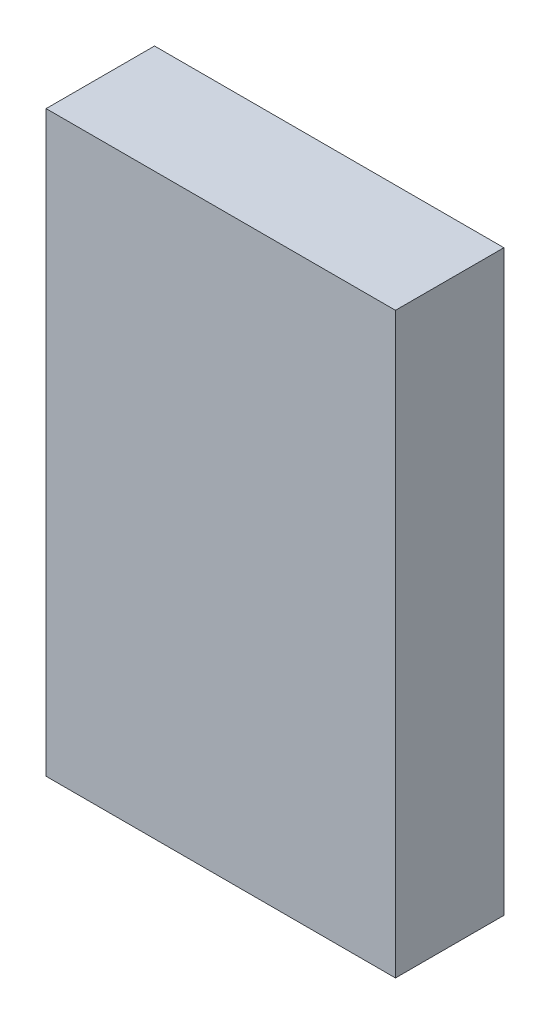
ISO-10303-21;
HEADER;
FILE_DESCRIPTION(('STEP AP214'),'2;1');
FILE_NAME('part.step','',(''),(''),'','','');
FILE_SCHEMA(('AUTOMOTIVE_DESIGN { 1 0 10303 214 1 1 1 1 }'));
ENDSEC;
DATA;
#1=APPLICATION_CONTEXT('core data for automotive mechanical design processes');
#2=APPLICATION_PROTOCOL_DEFINITION('international standard','automotive_design',2000,#1);
#3=PRODUCT_CONTEXT('',#1,'mechanical');
#4=PRODUCT('Part','Part','',(#3));
#5=PRODUCT_RELATED_PRODUCT_CATEGORY('part','',(#4));
#6=PRODUCT_DEFINITION_FORMATION('','',#4);
#7=PRODUCT_DEFINITION_CONTEXT('part definition',#1,'design');
#8=PRODUCT_DEFINITION('design','',#6,#7);
#9=PRODUCT_DEFINITION_SHAPE('','',#8);
#10=(LENGTH_UNIT() NAMED_UNIT(*) SI_UNIT(.MILLI.,.METRE.));
#11=(NAMED_UNIT(*) PLANE_ANGLE_UNIT() SI_UNIT($,.RADIAN.));
#12=(NAMED_UNIT(*) SI_UNIT($,.STERADIAN.) SOLID_ANGLE_UNIT());
#13=UNCERTAINTY_MEASURE_WITH_UNIT(LENGTH_MEASURE(1.E-05),#10,'distance_accuracy_value','');
#14=(GEOMETRIC_REPRESENTATION_CONTEXT(3) GLOBAL_UNCERTAINTY_ASSIGNED_CONTEXT((#13)) GLOBAL_UNIT_ASSIGNED_CONTEXT((#10,
#11,#12)) REPRESENTATION_CONTEXT('',''));
#15=CARTESIAN_POINT('',(0.,0.,0.));
#16=DIRECTION('',(0.,0.,1.));
#17=DIRECTION('',(1.,0.,0.));
#18=AXIS2_PLACEMENT_3D('',#15,#16,#17);
#19=CARTESIAN_POINT('',(36.83,-60.96,22.86));
#20=DIRECTION('',(-1.,0.,0.));
#21=DIRECTION('',(0.,0.,1.));
#22=AXIS2_PLACEMENT_3D('',#19,#20,#21);
#23=PLANE('',#22);
#24=DIRECTION('',(0.,1.,0.));
#25=VECTOR('',#24,1.);
#26=CARTESIAN_POINT('',(36.83,-60.96,0.));
#27=LINE('',#26,#25);
#28=CARTESIAN_POINT('',(36.83,-60.96,0.));
#29=VERTEX_POINT('',#28);
#30=CARTESIAN_POINT('',(36.83,60.96,0.));
#31=VERTEX_POINT('',#30);
#32=EDGE_CURVE('E95',#29,#31,#27,.T.);
#33=ORIENTED_EDGE('',*,*,#32,.T.);
#34=DIRECTION('',(0.,0.,-1.));
#35=VECTOR('',#34,1.);
#36=CARTESIAN_POINT('',(36.83,60.96,22.86));
#37=LINE('',#36,#35);
#38=CARTESIAN_POINT('',(36.83,60.96,22.86));
#39=VERTEX_POINT('',#38);
#40=EDGE_CURVE('E11',#39,#31,#37,.T.);
#41=ORIENTED_EDGE('',*,*,#40,.F.);
#42=DIRECTION('',(0.,1.,0.));
#43=VECTOR('',#42,1.);
#44=CARTESIAN_POINT('',(36.83,-60.96,22.86));
#45=LINE('',#44,#43);
#46=CARTESIAN_POINT('',(36.83,-60.96,22.86));
#47=VERTEX_POINT('',#46);
#48=EDGE_CURVE('E83',#47,#39,#45,.T.);
#49=ORIENTED_EDGE('',*,*,#48,.F.);
#50=DIRECTION('',(0.,0.,-1.));
#51=VECTOR('',#50,1.);
#52=CARTESIAN_POINT('',(36.83,-60.96,22.86));
#53=LINE('',#52,#51);
#54=EDGE_CURVE('E91',#47,#29,#53,.T.);
#55=ORIENTED_EDGE('',*,*,#54,.T.);
#56=EDGE_LOOP('',(#33,#41,#49,#55));
#57=FACE_BOUND('',#56,.T.);
#58=ADVANCED_FACE('F32',(#57),#23,.F.);
#59=CARTESIAN_POINT('',(-36.83,60.96,22.86));
#60=DIRECTION('',(0.,-1.,0.));
#61=DIRECTION('',(0.,0.,-1.));
#62=AXIS2_PLACEMENT_3D('',#59,#60,#61);
#63=PLANE('',#62);
#64=DIRECTION('',(-1.,0.,0.));
#65=VECTOR('',#64,1.);
#66=CARTESIAN_POINT('',(-36.83,60.96,0.));
#67=LINE('',#66,#65);
#68=CARTESIAN_POINT('',(-36.83,60.96,0.));
#69=VERTEX_POINT('',#68);
#70=EDGE_CURVE('E87',#31,#69,#67,.T.);
#71=ORIENTED_EDGE('',*,*,#70,.T.);
#72=DIRECTION('',(0.,0.,-1.));
#73=VECTOR('',#72,1.);
#74=CARTESIAN_POINT('',(-36.83,60.96,22.86));
#75=LINE('',#74,#73);
#76=CARTESIAN_POINT('',(-36.83,60.96,22.86));
#77=VERTEX_POINT('',#76);
#78=EDGE_CURVE('E40',#77,#69,#75,.T.);
#79=ORIENTED_EDGE('',*,*,#78,.F.);
#80=DIRECTION('',(-1.,0.,0.));
#81=VECTOR('',#80,1.);
#82=CARTESIAN_POINT('',(-36.83,60.96,22.86));
#83=LINE('',#82,#81);
#84=EDGE_CURVE('E78',#39,#77,#83,.T.);
#85=ORIENTED_EDGE('',*,*,#84,.F.);
#86=ORIENTED_EDGE('',*,*,#40,.T.);
#87=EDGE_LOOP('',(#71,#79,#85,#86));
#88=FACE_BOUND('',#87,.T.);
#89=ADVANCED_FACE('F86',(#88),#63,.F.);
#90=CARTESIAN_POINT('',(-36.83,-60.96,22.86));
#91=DIRECTION('',(1.,0.,0.));
#92=DIRECTION('',(0.,0.,-1.));
#93=AXIS2_PLACEMENT_3D('',#90,#91,#92);
#94=PLANE('',#93);
#95=DIRECTION('',(0.,-1.,0.));
#96=VECTOR('',#95,1.);
#97=CARTESIAN_POINT('',(-36.83,-60.96,0.));
#98=LINE('',#97,#96);
#99=CARTESIAN_POINT('',(-36.83,-60.96,0.));
#100=VERTEX_POINT('',#99);
#101=EDGE_CURVE('E65',#69,#100,#98,.T.);
#102=ORIENTED_EDGE('',*,*,#101,.T.);
#103=DIRECTION('',(0.,0.,-1.));
#104=VECTOR('',#103,1.);
#105=CARTESIAN_POINT('',(-36.83,-60.96,22.86));
#106=LINE('',#105,#104);
#107=CARTESIAN_POINT('',(-36.83,-60.96,22.86));
#108=VERTEX_POINT('',#107);
#109=EDGE_CURVE('E88',#108,#100,#106,.T.);
#110=ORIENTED_EDGE('',*,*,#109,.F.);
#111=DIRECTION('',(0.,-1.,0.));
#112=VECTOR('',#111,1.);
#113=CARTESIAN_POINT('',(-36.83,-60.96,22.86));
#114=LINE('',#113,#112);
#115=EDGE_CURVE('E81',#77,#108,#114,.T.);
#116=ORIENTED_EDGE('',*,*,#115,.F.);
#117=ORIENTED_EDGE('',*,*,#78,.T.);
#118=EDGE_LOOP('',(#102,#110,#116,#117));
#119=FACE_BOUND('',#118,.T.);
#120=ADVANCED_FACE('F89',(#119),#94,.F.);
#121=CARTESIAN_POINT('',(-36.83,-60.96,22.86));
#122=DIRECTION('',(0.,1.,0.));
#123=DIRECTION('',(0.,0.,1.));
#124=AXIS2_PLACEMENT_3D('',#121,#122,#123);
#125=PLANE('',#124);
#126=DIRECTION('',(1.,0.,0.));
#127=VECTOR('',#126,1.);
#128=CARTESIAN_POINT('',(-36.83,-60.96,0.));
#129=LINE('',#128,#127);
#130=EDGE_CURVE('E71',#100,#29,#129,.T.);
#131=ORIENTED_EDGE('',*,*,#130,.T.);
#132=ORIENTED_EDGE('',*,*,#54,.F.);
#133=DIRECTION('',(1.,0.,0.));
#134=VECTOR('',#133,1.);
#135=CARTESIAN_POINT('',(-36.83,-60.96,22.86));
#136=LINE('',#135,#134);
#137=EDGE_CURVE('E48',#108,#47,#136,.T.);
#138=ORIENTED_EDGE('',*,*,#137,.F.);
#139=ORIENTED_EDGE('',*,*,#109,.T.);
#140=EDGE_LOOP('',(#131,#132,#138,#139));
#141=FACE_BOUND('',#140,.T.);
#142=ADVANCED_FACE('F102',(#141),#125,.F.);
#143=CARTESIAN_POINT('',(0.,0.,22.86));
#144=DIRECTION('',(0.,0.,-1.));
#145=DIRECTION('',(-1.,0.,0.));
#146=AXIS2_PLACEMENT_3D('',#143,#144,#145);
#147=PLANE('',#146);
#148=ORIENTED_EDGE('',*,*,#48,.T.);
#149=ORIENTED_EDGE('',*,*,#84,.T.);
#150=ORIENTED_EDGE('',*,*,#115,.T.);
#151=ORIENTED_EDGE('',*,*,#137,.T.);
#152=EDGE_LOOP('',(#148,#149,#150,#151));
#153=FACE_BOUND('',#152,.T.);
#154=ADVANCED_FACE('F79',(#153),#147,.F.);
#155=CARTESIAN_POINT('',(0.,0.,0.));
#156=DIRECTION('',(0.,0.,-1.));
#157=DIRECTION('',(-1.,0.,0.));
#158=AXIS2_PLACEMENT_3D('',#155,#156,#157);
#159=PLANE('',#158);
#160=ORIENTED_EDGE('',*,*,#32,.F.);
#161=ORIENTED_EDGE('',*,*,#130,.F.);
#162=ORIENTED_EDGE('',*,*,#101,.F.);
#163=ORIENTED_EDGE('',*,*,#70,.F.);
#164=EDGE_LOOP('',(#160,#161,#162,#163));
#165=FACE_BOUND('',#164,.T.);
#166=ADVANCED_FACE('F105',(#165),#159,.T.);
#167=CLOSED_SHELL('',(#58,#89,#120,#142,#154,#166));
#168=MANIFOLD_SOLID_BREP('B2',#167);
#169=ADVANCED_BREP_SHAPE_REPRESENTATION('',(#18,#168),#14);
#170=SHAPE_DEFINITION_REPRESENTATION(#9,#169);
ENDSEC;
END-ISO-10303-21;
